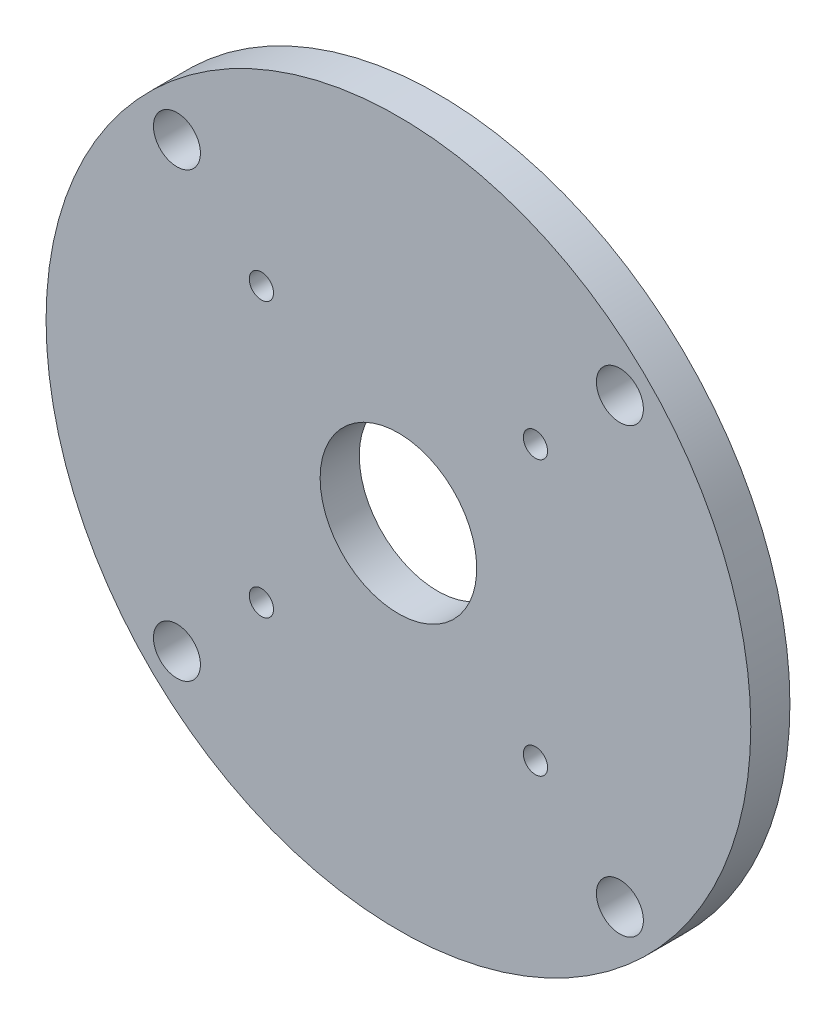
ISO-10303-21;
HEADER;
FILE_DESCRIPTION(('STEP AP214'),'2;1');
FILE_NAME('part.step','',(''),(''),'','','');
FILE_SCHEMA(('AUTOMOTIVE_DESIGN { 1 0 10303 214 1 1 1 1 }'));
ENDSEC;
DATA;
#1=APPLICATION_CONTEXT('core data for automotive mechanical design processes');
#2=APPLICATION_PROTOCOL_DEFINITION('international standard','automotive_design',2000,#1);
#3=PRODUCT_CONTEXT('',#1,'mechanical');
#4=PRODUCT('Part','Part','',(#3));
#5=PRODUCT_RELATED_PRODUCT_CATEGORY('part','',(#4));
#6=PRODUCT_DEFINITION_FORMATION('','',#4);
#7=PRODUCT_DEFINITION_CONTEXT('part definition',#1,'design');
#8=PRODUCT_DEFINITION('design','',#6,#7);
#9=PRODUCT_DEFINITION_SHAPE('','',#8);
#10=(LENGTH_UNIT() NAMED_UNIT(*) SI_UNIT(.MILLI.,.METRE.));
#11=(NAMED_UNIT(*) PLANE_ANGLE_UNIT() SI_UNIT($,.RADIAN.));
#12=(NAMED_UNIT(*) SI_UNIT($,.STERADIAN.) SOLID_ANGLE_UNIT());
#13=UNCERTAINTY_MEASURE_WITH_UNIT(LENGTH_MEASURE(1.E-05),#10,'distance_accuracy_value','');
#14=(GEOMETRIC_REPRESENTATION_CONTEXT(3) GLOBAL_UNCERTAINTY_ASSIGNED_CONTEXT((#13)) GLOBAL_UNIT_ASSIGNED_CONTEXT((#10,
#11,#12)) REPRESENTATION_CONTEXT('',''));
#15=CARTESIAN_POINT('',(0.,0.,0.));
#16=DIRECTION('',(0.,0.,1.));
#17=DIRECTION('',(1.,0.,0.));
#18=AXIS2_PLACEMENT_3D('',#15,#16,#17);
#19=CARTESIAN_POINT('',(0.,0.,6.35));
#20=DIRECTION('',(0.,0.,-1.));
#21=DIRECTION('',(-1.,0.,0.));
#22=AXIS2_PLACEMENT_3D('',#19,#20,#21);
#23=CYLINDRICAL_SURFACE('',#22,57.15);
#24=CARTESIAN_POINT('',(0.,0.,6.35));
#25=DIRECTION('',(0.,0.,1.));
#26=DIRECTION('',(1.,0.,0.));
#27=AXIS2_PLACEMENT_3D('',#24,#25,#26);
#28=CIRCLE('',#27,57.15);
#29=CARTESIAN_POINT('',(57.15,0.,6.35));
#30=VERTEX_POINT('',#29);
#31=EDGE_CURVE('E10',#30,#30,#28,.T.);
#32=ORIENTED_EDGE('',*,*,#31,.F.);
#33=EDGE_LOOP('',(#32));
#34=FACE_BOUND('',#33,.T.);
#35=CARTESIAN_POINT('',(0.,0.,0.));
#36=DIRECTION('',(0.,0.,1.));
#37=DIRECTION('',(1.,0.,0.));
#38=AXIS2_PLACEMENT_3D('',#35,#36,#37);
#39=CIRCLE('',#38,57.15);
#40=CARTESIAN_POINT('',(57.15,0.,0.));
#41=VERTEX_POINT('',#40);
#42=EDGE_CURVE('E33',#41,#41,#39,.T.);
#43=ORIENTED_EDGE('',*,*,#42,.T.);
#44=EDGE_LOOP('',(#43));
#45=FACE_BOUND('',#44,.T.);
#46=ADVANCED_FACE('F30',(#34,#45),#23,.T.);
#47=CARTESIAN_POINT('',(0.,0.,6.35));
#48=DIRECTION('',(0.,0.,1.));
#49=DIRECTION('',(1.,0.,0.));
#50=AXIS2_PLACEMENT_3D('',#47,#48,#49);
#51=PLANE('',#50);
#52=CARTESIAN_POINT('',(-22.225,-22.225,6.35));
#53=DIRECTION('',(0.,0.,1.));
#54=DIRECTION('',(1.,0.,0.));
#55=AXIS2_PLACEMENT_3D('',#52,#53,#54);
#56=CIRCLE('',#55,1.9685);
#57=CARTESIAN_POINT('',(-20.2565,-22.225,6.35));
#58=VERTEX_POINT('',#57);
#59=EDGE_CURVE('E90',#58,#58,#56,.T.);
#60=ORIENTED_EDGE('',*,*,#59,.F.);
#61=EDGE_LOOP('',(#60));
#62=FACE_BOUND('',#61,.T.);
#63=CARTESIAN_POINT('',(22.225,-22.225,6.35));
#64=DIRECTION('',(0.,0.,1.));
#65=DIRECTION('',(1.,0.,0.));
#66=AXIS2_PLACEMENT_3D('',#63,#64,#65);
#67=CIRCLE('',#66,1.9685);
#68=CARTESIAN_POINT('',(24.1935,-22.225,6.35));
#69=VERTEX_POINT('',#68);
#70=EDGE_CURVE('E84',#69,#69,#67,.T.);
#71=ORIENTED_EDGE('',*,*,#70,.F.);
#72=EDGE_LOOP('',(#71));
#73=FACE_BOUND('',#72,.T.);
#74=CARTESIAN_POINT('',(22.225,22.225,6.35));
#75=DIRECTION('',(0.,0.,1.));
#76=DIRECTION('',(1.,0.,0.));
#77=AXIS2_PLACEMENT_3D('',#74,#75,#76);
#78=CIRCLE('',#77,1.9685);
#79=CARTESIAN_POINT('',(24.1935,22.225,6.35));
#80=VERTEX_POINT('',#79);
#81=EDGE_CURVE('E78',#80,#80,#78,.T.);
#82=ORIENTED_EDGE('',*,*,#81,.F.);
#83=EDGE_LOOP('',(#82));
#84=FACE_BOUND('',#83,.T.);
#85=CARTESIAN_POINT('',(-22.225,22.225,6.35));
#86=DIRECTION('',(0.,0.,1.));
#87=DIRECTION('',(1.,0.,0.));
#88=AXIS2_PLACEMENT_3D('',#85,#86,#87);
#89=CIRCLE('',#88,1.9685);
#90=CARTESIAN_POINT('',(-20.2565,22.225,6.35));
#91=VERTEX_POINT('',#90);
#92=EDGE_CURVE('E72',#91,#91,#89,.T.);
#93=ORIENTED_EDGE('',*,*,#92,.F.);
#94=EDGE_LOOP('',(#93));
#95=FACE_BOUND('',#94,.T.);
#96=CARTESIAN_POINT('',(0.,0.,6.35));
#97=DIRECTION('',(0.,0.,-1.));
#98=DIRECTION('',(-1.,0.,0.));
#99=AXIS2_PLACEMENT_3D('',#96,#97,#98);
#100=CIRCLE('',#99,12.7);
#101=CARTESIAN_POINT('',(-12.7,0.,6.35));
#102=VERTEX_POINT('',#101);
#103=EDGE_CURVE('E63',#102,#102,#100,.T.);
#104=ORIENTED_EDGE('',*,*,#103,.T.);
#105=EDGE_LOOP('',(#104));
#106=FACE_BOUND('',#105,.T.);
#107=CARTESIAN_POINT('',(35.9210244842766,-35.9210244842766,6.35));
#108=DIRECTION('',(0.,0.,-1.));
#109=DIRECTION('',(-1.,0.,0.));
#110=AXIS2_PLACEMENT_3D('',#107,#108,#109);
#111=CIRCLE('',#110,3.81000000000565);
#112=CARTESIAN_POINT('',(32.111024484271,-35.9210244842766,6.35));
#113=VERTEX_POINT('',#112);
#114=EDGE_CURVE('E57',#113,#113,#111,.T.);
#115=ORIENTED_EDGE('',*,*,#114,.T.);
#116=EDGE_LOOP('',(#115));
#117=FACE_BOUND('',#116,.T.);
#118=CARTESIAN_POINT('',(-35.9210244842766,-35.9210244842766,6.35));
#119=DIRECTION('',(0.,0.,-1.));
#120=DIRECTION('',(-1.,0.,0.));
#121=AXIS2_PLACEMENT_3D('',#118,#119,#120);
#122=CIRCLE('',#121,3.80999999999969);
#123=CARTESIAN_POINT('',(-39.7310244842763,-35.9210244842766,6.35));
#124=VERTEX_POINT('',#123);
#125=EDGE_CURVE('E51',#124,#124,#122,.T.);
#126=ORIENTED_EDGE('',*,*,#125,.T.);
#127=EDGE_LOOP('',(#126));
#128=FACE_BOUND('',#127,.T.);
#129=CARTESIAN_POINT('',(-35.9210244842766,35.9210244842766,6.35));
#130=DIRECTION('',(0.,0.,-1.));
#131=DIRECTION('',(-1.,0.,0.));
#132=AXIS2_PLACEMENT_3D('',#129,#130,#131);
#133=CIRCLE('',#132,3.81);
#134=CARTESIAN_POINT('',(-39.7310244842766,35.9210244842766,6.35));
#135=VERTEX_POINT('',#134);
#136=EDGE_CURVE('E45',#135,#135,#133,.T.);
#137=ORIENTED_EDGE('',*,*,#136,.T.);
#138=EDGE_LOOP('',(#137));
#139=FACE_BOUND('',#138,.T.);
#140=CARTESIAN_POINT('',(35.9210244842766,35.9210244842766,6.35));
#141=DIRECTION('',(0.,0.,-1.));
#142=DIRECTION('',(-1.,0.,0.));
#143=AXIS2_PLACEMENT_3D('',#140,#141,#142);
#144=CIRCLE('',#143,3.81000000000401);
#145=CARTESIAN_POINT('',(32.1110244842726,35.9210244842766,6.35));
#146=VERTEX_POINT('',#145);
#147=EDGE_CURVE('E40',#146,#146,#144,.T.);
#148=ORIENTED_EDGE('',*,*,#147,.T.);
#149=EDGE_LOOP('',(#148));
#150=FACE_BOUND('',#149,.T.);
#151=ORIENTED_EDGE('',*,*,#31,.T.);
#152=EDGE_LOOP('',(#151));
#153=FACE_BOUND('',#152,.T.);
#154=ADVANCED_FACE('F106',(#62,#73,#84,#95,#106,#117,#128,#139,#150,#153),#51,.T.);
#155=CARTESIAN_POINT('',(0.,0.,0.));
#156=DIRECTION('',(0.,0.,1.));
#157=DIRECTION('',(1.,0.,0.));
#158=AXIS2_PLACEMENT_3D('',#155,#156,#157);
#159=PLANE('',#158);
#160=CARTESIAN_POINT('',(-22.225,-22.225,0.));
#161=DIRECTION('',(0.,0.,1.));
#162=DIRECTION('',(1.,0.,0.));
#163=AXIS2_PLACEMENT_3D('',#160,#161,#162);
#164=CIRCLE('',#163,1.9685);
#165=CARTESIAN_POINT('',(-20.2565,-22.225,0.));
#166=VERTEX_POINT('',#165);
#167=EDGE_CURVE('E87',#166,#166,#164,.T.);
#168=ORIENTED_EDGE('',*,*,#167,.T.);
#169=EDGE_LOOP('',(#168));
#170=FACE_BOUND('',#169,.T.);
#171=CARTESIAN_POINT('',(22.225,-22.225,0.));
#172=DIRECTION('',(0.,0.,1.));
#173=DIRECTION('',(1.,0.,0.));
#174=AXIS2_PLACEMENT_3D('',#171,#172,#173);
#175=CIRCLE('',#174,1.9685);
#176=CARTESIAN_POINT('',(24.1935,-22.225,0.));
#177=VERTEX_POINT('',#176);
#178=EDGE_CURVE('E81',#177,#177,#175,.T.);
#179=ORIENTED_EDGE('',*,*,#178,.T.);
#180=EDGE_LOOP('',(#179));
#181=FACE_BOUND('',#180,.T.);
#182=CARTESIAN_POINT('',(22.225,22.225,0.));
#183=DIRECTION('',(0.,0.,1.));
#184=DIRECTION('',(1.,0.,0.));
#185=AXIS2_PLACEMENT_3D('',#182,#183,#184);
#186=CIRCLE('',#185,1.9685);
#187=CARTESIAN_POINT('',(24.1935,22.225,0.));
#188=VERTEX_POINT('',#187);
#189=EDGE_CURVE('E75',#188,#188,#186,.T.);
#190=ORIENTED_EDGE('',*,*,#189,.T.);
#191=EDGE_LOOP('',(#190));
#192=FACE_BOUND('',#191,.T.);
#193=CARTESIAN_POINT('',(-22.225,22.225,0.));
#194=DIRECTION('',(0.,0.,1.));
#195=DIRECTION('',(1.,0.,0.));
#196=AXIS2_PLACEMENT_3D('',#193,#194,#195);
#197=CIRCLE('',#196,1.9685);
#198=CARTESIAN_POINT('',(-20.2565,22.225,0.));
#199=VERTEX_POINT('',#198);
#200=EDGE_CURVE('E69',#199,#199,#197,.T.);
#201=ORIENTED_EDGE('',*,*,#200,.T.);
#202=EDGE_LOOP('',(#201));
#203=FACE_BOUND('',#202,.T.);
#204=CARTESIAN_POINT('',(0.,0.,0.));
#205=DIRECTION('',(0.,0.,-1.));
#206=DIRECTION('',(-1.,0.,0.));
#207=AXIS2_PLACEMENT_3D('',#204,#205,#206);
#208=CIRCLE('',#207,12.7);
#209=CARTESIAN_POINT('',(-12.7,0.,0.));
#210=VERTEX_POINT('',#209);
#211=EDGE_CURVE('E66',#210,#210,#208,.T.);
#212=ORIENTED_EDGE('',*,*,#211,.F.);
#213=EDGE_LOOP('',(#212));
#214=FACE_BOUND('',#213,.T.);
#215=CARTESIAN_POINT('',(35.9210244842766,-35.9210244842766,0.));
#216=DIRECTION('',(0.,0.,-1.));
#217=DIRECTION('',(-1.,0.,0.));
#218=AXIS2_PLACEMENT_3D('',#215,#216,#217);
#219=CIRCLE('',#218,3.81000000000565);
#220=CARTESIAN_POINT('',(32.111024484271,-35.9210244842766,0.));
#221=VERTEX_POINT('',#220);
#222=EDGE_CURVE('E60',#221,#221,#219,.T.);
#223=ORIENTED_EDGE('',*,*,#222,.F.);
#224=EDGE_LOOP('',(#223));
#225=FACE_BOUND('',#224,.T.);
#226=CARTESIAN_POINT('',(-35.9210244842766,-35.9210244842766,0.));
#227=DIRECTION('',(0.,0.,-1.));
#228=DIRECTION('',(-1.,0.,0.));
#229=AXIS2_PLACEMENT_3D('',#226,#227,#228);
#230=CIRCLE('',#229,3.80999999999969);
#231=CARTESIAN_POINT('',(-39.7310244842763,-35.9210244842766,0.));
#232=VERTEX_POINT('',#231);
#233=EDGE_CURVE('E54',#232,#232,#230,.T.);
#234=ORIENTED_EDGE('',*,*,#233,.F.);
#235=EDGE_LOOP('',(#234));
#236=FACE_BOUND('',#235,.T.);
#237=CARTESIAN_POINT('',(-35.9210244842766,35.9210244842766,0.));
#238=DIRECTION('',(0.,0.,-1.));
#239=DIRECTION('',(-1.,0.,0.));
#240=AXIS2_PLACEMENT_3D('',#237,#238,#239);
#241=CIRCLE('',#240,3.81);
#242=CARTESIAN_POINT('',(-39.7310244842766,35.9210244842766,0.));
#243=VERTEX_POINT('',#242);
#244=EDGE_CURVE('E48',#243,#243,#241,.T.);
#245=ORIENTED_EDGE('',*,*,#244,.F.);
#246=EDGE_LOOP('',(#245));
#247=FACE_BOUND('',#246,.T.);
#248=CARTESIAN_POINT('',(35.9210244842766,35.9210244842766,0.));
#249=DIRECTION('',(0.,0.,-1.));
#250=DIRECTION('',(-1.,0.,0.));
#251=AXIS2_PLACEMENT_3D('',#248,#249,#250);
#252=CIRCLE('',#251,3.81000000000401);
#253=CARTESIAN_POINT('',(32.1110244842726,35.9210244842766,0.));
#254=VERTEX_POINT('',#253);
#255=EDGE_CURVE('E42',#254,#254,#252,.T.);
#256=ORIENTED_EDGE('',*,*,#255,.F.);
#257=EDGE_LOOP('',(#256));
#258=FACE_BOUND('',#257,.T.);
#259=ORIENTED_EDGE('',*,*,#42,.F.);
#260=EDGE_LOOP('',(#259));
#261=FACE_BOUND('',#260,.T.);
#262=ADVANCED_FACE('F96',(#170,#181,#192,#203,#214,#225,#236,#247,#258,#261),#159,.F.);
#263=CARTESIAN_POINT('',(35.9210244842766,35.9210244842766,6.35));
#264=DIRECTION('',(0.,0.,-1.));
#265=DIRECTION('',(-1.,0.,0.));
#266=AXIS2_PLACEMENT_3D('',#263,#264,#265);
#267=CYLINDRICAL_SURFACE('',#266,3.81000000000401);
#268=ORIENTED_EDGE('',*,*,#147,.F.);
#269=EDGE_LOOP('',(#268));
#270=FACE_BOUND('',#269,.T.);
#271=ORIENTED_EDGE('',*,*,#255,.T.);
#272=EDGE_LOOP('',(#271));
#273=FACE_BOUND('',#272,.T.);
#274=ADVANCED_FACE('F126',(#270,#273),#267,.F.);
#275=CARTESIAN_POINT('',(-35.9210244842766,35.9210244842766,6.35));
#276=DIRECTION('',(0.,0.,-1.));
#277=DIRECTION('',(-1.,0.,0.));
#278=AXIS2_PLACEMENT_3D('',#275,#276,#277);
#279=CYLINDRICAL_SURFACE('',#278,3.81);
#280=ORIENTED_EDGE('',*,*,#136,.F.);
#281=EDGE_LOOP('',(#280));
#282=FACE_BOUND('',#281,.T.);
#283=ORIENTED_EDGE('',*,*,#244,.T.);
#284=EDGE_LOOP('',(#283));
#285=FACE_BOUND('',#284,.T.);
#286=ADVANCED_FACE('F129',(#282,#285),#279,.F.);
#287=CARTESIAN_POINT('',(-35.9210244842766,-35.9210244842766,6.35));
#288=DIRECTION('',(0.,0.,-1.));
#289=DIRECTION('',(-1.,0.,0.));
#290=AXIS2_PLACEMENT_3D('',#287,#288,#289);
#291=CYLINDRICAL_SURFACE('',#290,3.80999999999969);
#292=ORIENTED_EDGE('',*,*,#125,.F.);
#293=EDGE_LOOP('',(#292));
#294=FACE_BOUND('',#293,.T.);
#295=ORIENTED_EDGE('',*,*,#233,.T.);
#296=EDGE_LOOP('',(#295));
#297=FACE_BOUND('',#296,.T.);
#298=ADVANCED_FACE('F161',(#294,#297),#291,.F.);
#299=CARTESIAN_POINT('',(35.9210244842766,-35.9210244842766,6.35));
#300=DIRECTION('',(0.,0.,-1.));
#301=DIRECTION('',(-1.,0.,0.));
#302=AXIS2_PLACEMENT_3D('',#299,#300,#301);
#303=CYLINDRICAL_SURFACE('',#302,3.81000000000565);
#304=ORIENTED_EDGE('',*,*,#114,.F.);
#305=EDGE_LOOP('',(#304));
#306=FACE_BOUND('',#305,.T.);
#307=ORIENTED_EDGE('',*,*,#222,.T.);
#308=EDGE_LOOP('',(#307));
#309=FACE_BOUND('',#308,.T.);
#310=ADVANCED_FACE('F169',(#306,#309),#303,.F.);
#311=CARTESIAN_POINT('',(0.,0.,6.35));
#312=DIRECTION('',(0.,0.,-1.));
#313=DIRECTION('',(-1.,0.,0.));
#314=AXIS2_PLACEMENT_3D('',#311,#312,#313);
#315=CYLINDRICAL_SURFACE('',#314,12.7);
#316=ORIENTED_EDGE('',*,*,#103,.F.);
#317=EDGE_LOOP('',(#316));
#318=FACE_BOUND('',#317,.T.);
#319=ORIENTED_EDGE('',*,*,#211,.T.);
#320=EDGE_LOOP('',(#319));
#321=FACE_BOUND('',#320,.T.);
#322=ADVANCED_FACE('F177',(#318,#321),#315,.F.);
#323=CARTESIAN_POINT('',(-22.225,22.225,0.));
#324=DIRECTION('',(0.,0.,1.));
#325=DIRECTION('',(1.,0.,0.));
#326=AXIS2_PLACEMENT_3D('',#323,#324,#325);
#327=CYLINDRICAL_SURFACE('',#326,1.9685);
#328=ORIENTED_EDGE('',*,*,#200,.F.);
#329=EDGE_LOOP('',(#328));
#330=FACE_BOUND('',#329,.T.);
#331=ORIENTED_EDGE('',*,*,#92,.T.);
#332=EDGE_LOOP('',(#331));
#333=FACE_BOUND('',#332,.T.);
#334=ADVANCED_FACE('F184',(#330,#333),#327,.F.);
#335=CARTESIAN_POINT('',(22.225,22.225,0.));
#336=DIRECTION('',(0.,0.,1.));
#337=DIRECTION('',(1.,0.,0.));
#338=AXIS2_PLACEMENT_3D('',#335,#336,#337);
#339=CYLINDRICAL_SURFACE('',#338,1.9685);
#340=ORIENTED_EDGE('',*,*,#189,.F.);
#341=EDGE_LOOP('',(#340));
#342=FACE_BOUND('',#341,.T.);
#343=ORIENTED_EDGE('',*,*,#81,.T.);
#344=EDGE_LOOP('',(#343));
#345=FACE_BOUND('',#344,.T.);
#346=ADVANCED_FACE('F191',(#342,#345),#339,.F.);
#347=CARTESIAN_POINT('',(22.225,-22.225,0.));
#348=DIRECTION('',(0.,0.,1.));
#349=DIRECTION('',(1.,0.,0.));
#350=AXIS2_PLACEMENT_3D('',#347,#348,#349);
#351=CYLINDRICAL_SURFACE('',#350,1.9685);
#352=ORIENTED_EDGE('',*,*,#178,.F.);
#353=EDGE_LOOP('',(#352));
#354=FACE_BOUND('',#353,.T.);
#355=ORIENTED_EDGE('',*,*,#70,.T.);
#356=EDGE_LOOP('',(#355));
#357=FACE_BOUND('',#356,.T.);
#358=ADVANCED_FACE('F102',(#354,#357),#351,.F.);
#359=CARTESIAN_POINT('',(-22.225,-22.225,0.));
#360=DIRECTION('',(0.,0.,1.));
#361=DIRECTION('',(1.,0.,0.));
#362=AXIS2_PLACEMENT_3D('',#359,#360,#361);
#363=CYLINDRICAL_SURFACE('',#362,1.9685);
#364=ORIENTED_EDGE('',*,*,#167,.F.);
#365=EDGE_LOOP('',(#364));
#366=FACE_BOUND('',#365,.T.);
#367=ORIENTED_EDGE('',*,*,#59,.T.);
#368=EDGE_LOOP('',(#367));
#369=FACE_BOUND('',#368,.T.);
#370=ADVANCED_FACE('F99',(#366,#369),#363,.F.);
#371=CLOSED_SHELL('',(#46,#154,#262,#274,#286,#298,#310,#322,#334,#346,#358,#370));
#372=MANIFOLD_SOLID_BREP('B2',#371);
#373=ADVANCED_BREP_SHAPE_REPRESENTATION('',(#18,#372),#14);
#374=SHAPE_DEFINITION_REPRESENTATION(#9,#373);
ENDSEC;
END-ISO-10303-21;
